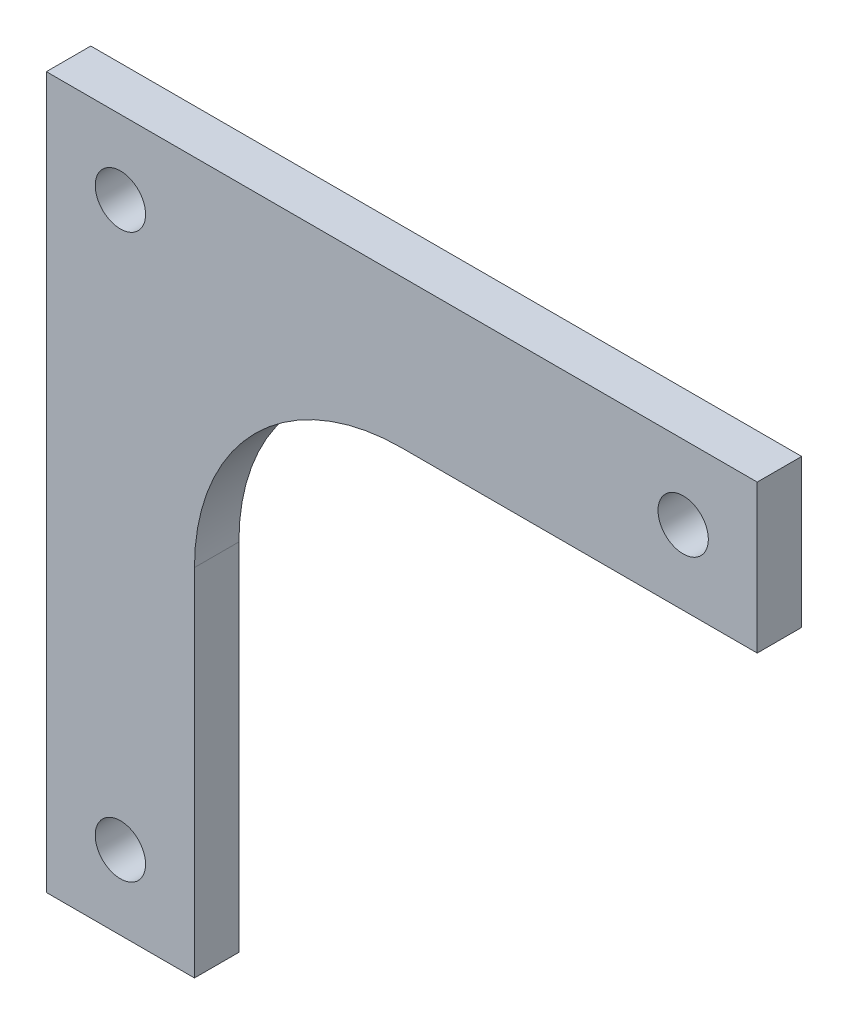
ISO-10303-21;
HEADER;
FILE_DESCRIPTION(('STEP AP214'),'2;1');
FILE_NAME('part.step','',(''),(''),'','','');
FILE_SCHEMA(('AUTOMOTIVE_DESIGN { 1 0 10303 214 1 1 1 1 }'));
ENDSEC;
DATA;
#1=APPLICATION_CONTEXT('core data for automotive mechanical design processes');
#2=APPLICATION_PROTOCOL_DEFINITION('international standard','automotive_design',2000,#1);
#3=PRODUCT_CONTEXT('',#1,'mechanical');
#4=PRODUCT('Part','Part','',(#3));
#5=PRODUCT_RELATED_PRODUCT_CATEGORY('part','',(#4));
#6=PRODUCT_DEFINITION_FORMATION('','',#4);
#7=PRODUCT_DEFINITION_CONTEXT('part definition',#1,'design');
#8=PRODUCT_DEFINITION('design','',#6,#7);
#9=PRODUCT_DEFINITION_SHAPE('','',#8);
#10=(LENGTH_UNIT() NAMED_UNIT(*) SI_UNIT(.MILLI.,.METRE.));
#11=(NAMED_UNIT(*) PLANE_ANGLE_UNIT() SI_UNIT($,.RADIAN.));
#12=(NAMED_UNIT(*) SI_UNIT($,.STERADIAN.) SOLID_ANGLE_UNIT());
#13=UNCERTAINTY_MEASURE_WITH_UNIT(LENGTH_MEASURE(1.E-05),#10,'distance_accuracy_value','');
#14=(GEOMETRIC_REPRESENTATION_CONTEXT(3) GLOBAL_UNCERTAINTY_ASSIGNED_CONTEXT((#13)) GLOBAL_UNIT_ASSIGNED_CONTEXT((#10,
#11,#12)) REPRESENTATION_CONTEXT('',''));
#15=CARTESIAN_POINT('',(0.,0.,0.));
#16=DIRECTION('',(0.,0.,1.));
#17=DIRECTION('',(1.,0.,0.));
#18=AXIS2_PLACEMENT_3D('',#15,#16,#17);
#19=CARTESIAN_POINT('',(24.,0.,3.));
#20=DIRECTION('',(0.,0.,1.));
#21=DIRECTION('',(1.,0.,0.));
#22=AXIS2_PLACEMENT_3D('',#19,#20,#21);
#23=PLANE('',#22);
#24=CARTESIAN_POINT('',(5.,-19.,3.));
#25=DIRECTION('',(0.,0.,1.));
#26=DIRECTION('',(1.,0.,0.));
#27=AXIS2_PLACEMENT_3D('',#24,#25,#26);
#28=CIRCLE('',#27,1.7);
#29=CARTESIAN_POINT('',(6.7,-19.,3.));
#30=VERTEX_POINT('',#29);
#31=EDGE_CURVE('E167',#30,#30,#28,.T.);
#32=ORIENTED_EDGE('',*,*,#31,.F.);
#33=EDGE_LOOP('',(#32));
#34=FACE_BOUND('',#33,.T.);
#35=DIRECTION('',(0.,-1.,0.));
#36=VECTOR('',#35,1.);
#37=CARTESIAN_POINT('',(0.,0.,3.));
#38=LINE('',#37,#36);
#39=CARTESIAN_POINT('',(0.,24.,3.));
#40=VERTEX_POINT('',#39);
#41=CARTESIAN_POINT('',(0.,-24.,3.));
#42=VERTEX_POINT('',#41);
#43=EDGE_CURVE('E87',#40,#42,#38,.T.);
#44=ORIENTED_EDGE('',*,*,#43,.T.);
#45=DIRECTION('',(1.,0.,0.));
#46=VECTOR('',#45,1.);
#47=CARTESIAN_POINT('',(10.,-24.,3.));
#48=LINE('',#47,#46);
#49=CARTESIAN_POINT('',(10.,-24.,3.));
#50=VERTEX_POINT('',#49);
#51=EDGE_CURVE('E153',#42,#50,#48,.T.);
#52=ORIENTED_EDGE('',*,*,#51,.T.);
#53=DIRECTION('',(0.,1.,0.));
#54=VECTOR('',#53,1.);
#55=CARTESIAN_POINT('',(10.,-12.,3.));
#56=LINE('',#55,#54);
#57=CARTESIAN_POINT('',(10.,0.,3.));
#58=VERTEX_POINT('',#57);
#59=EDGE_CURVE('E150',#50,#58,#56,.T.);
#60=ORIENTED_EDGE('',*,*,#59,.T.);
#61=CARTESIAN_POINT('',(24.,0.,3.));
#62=DIRECTION('',(0.,0.,-1.));
#63=DIRECTION('',(1.,0.,0.));
#64=AXIS2_PLACEMENT_3D('',#61,#62,#63);
#65=CIRCLE('',#64,14.);
#66=CARTESIAN_POINT('',(24.,14.,3.));
#67=VERTEX_POINT('',#66);
#68=EDGE_CURVE('E105',#58,#67,#65,.T.);
#69=ORIENTED_EDGE('',*,*,#68,.T.);
#70=DIRECTION('',(1.,0.,0.));
#71=VECTOR('',#70,1.);
#72=CARTESIAN_POINT('',(24.,14.,3.));
#73=LINE('',#72,#71);
#74=CARTESIAN_POINT('',(48.,14.,3.));
#75=VERTEX_POINT('',#74);
#76=EDGE_CURVE('E98',#67,#75,#73,.T.);
#77=ORIENTED_EDGE('',*,*,#76,.T.);
#78=DIRECTION('',(0.,1.,0.));
#79=VECTOR('',#78,1.);
#80=CARTESIAN_POINT('',(48.,24.,3.));
#81=LINE('',#80,#79);
#82=CARTESIAN_POINT('',(48.,24.,3.));
#83=VERTEX_POINT('',#82);
#84=EDGE_CURVE('E102',#75,#83,#81,.T.);
#85=ORIENTED_EDGE('',*,*,#84,.T.);
#86=DIRECTION('',(-1.,0.,0.));
#87=VECTOR('',#86,1.);
#88=CARTESIAN_POINT('',(38.,24.,3.));
#89=LINE('',#88,#87);
#90=EDGE_CURVE('E51',#83,#40,#89,.T.);
#91=ORIENTED_EDGE('',*,*,#90,.T.);
#92=EDGE_LOOP('',(#44,#52,#60,#69,#77,#85,#91));
#93=FACE_BOUND('',#92,.T.);
#94=CARTESIAN_POINT('',(43.,19.,3.));
#95=DIRECTION('',(0.,0.,1.));
#96=DIRECTION('',(1.,0.,0.));
#97=AXIS2_PLACEMENT_3D('',#94,#95,#96);
#98=CIRCLE('',#97,1.7);
#99=CARTESIAN_POINT('',(44.7,19.,3.));
#100=VERTEX_POINT('',#99);
#101=EDGE_CURVE('E128',#100,#100,#98,.T.);
#102=ORIENTED_EDGE('',*,*,#101,.F.);
#103=EDGE_LOOP('',(#102));
#104=FACE_BOUND('',#103,.T.);
#105=CARTESIAN_POINT('',(5.,19.,3.));
#106=DIRECTION('',(0.,0.,1.));
#107=DIRECTION('',(1.,0.,0.));
#108=AXIS2_PLACEMENT_3D('',#105,#106,#107);
#109=CIRCLE('',#108,1.7);
#110=CARTESIAN_POINT('',(6.7,19.,3.));
#111=VERTEX_POINT('',#110);
#112=EDGE_CURVE('E173',#111,#111,#109,.T.);
#113=ORIENTED_EDGE('',*,*,#112,.F.);
#114=EDGE_LOOP('',(#113));
#115=FACE_BOUND('',#114,.T.);
#116=ADVANCED_FACE('F34',(#34,#93,#104,#115),#23,.T.);
#117=CARTESIAN_POINT('',(24.,0.,0.));
#118=DIRECTION('',(0.,0.,1.));
#119=DIRECTION('',(1.,0.,0.));
#120=AXIS2_PLACEMENT_3D('',#117,#118,#119);
#121=PLANE('',#120);
#122=DIRECTION('',(1.,0.,0.));
#123=VECTOR('',#122,1.);
#124=CARTESIAN_POINT('',(10.,-24.,0.));
#125=LINE('',#124,#123);
#126=CARTESIAN_POINT('',(0.,-24.,0.));
#127=VERTEX_POINT('',#126);
#128=CARTESIAN_POINT('',(10.,-24.,0.));
#129=VERTEX_POINT('',#128);
#130=EDGE_CURVE('E124',#127,#129,#125,.T.);
#131=ORIENTED_EDGE('',*,*,#130,.F.);
#132=DIRECTION('',(0.,-1.,0.));
#133=VECTOR('',#132,1.);
#134=CARTESIAN_POINT('',(0.,0.,0.));
#135=LINE('',#134,#133);
#136=CARTESIAN_POINT('',(0.,24.,0.));
#137=VERTEX_POINT('',#136);
#138=EDGE_CURVE('E137',#137,#127,#135,.T.);
#139=ORIENTED_EDGE('',*,*,#138,.F.);
#140=DIRECTION('',(-1.,0.,0.));
#141=VECTOR('',#140,1.);
#142=CARTESIAN_POINT('',(0.,24.,0.));
#143=LINE('',#142,#141);
#144=CARTESIAN_POINT('',(48.,24.,0.));
#145=VERTEX_POINT('',#144);
#146=EDGE_CURVE('E77',#145,#137,#143,.T.);
#147=ORIENTED_EDGE('',*,*,#146,.F.);
#148=DIRECTION('',(0.,1.,0.));
#149=VECTOR('',#148,1.);
#150=CARTESIAN_POINT('',(48.,24.,0.));
#151=LINE('',#150,#149);
#152=CARTESIAN_POINT('',(48.,14.,0.));
#153=VERTEX_POINT('',#152);
#154=EDGE_CURVE('E134',#153,#145,#151,.T.);
#155=ORIENTED_EDGE('',*,*,#154,.F.);
#156=DIRECTION('',(1.,0.,0.));
#157=VECTOR('',#156,1.);
#158=CARTESIAN_POINT('',(48.,14.,0.));
#159=LINE('',#158,#157);
#160=CARTESIAN_POINT('',(24.,14.,0.));
#161=VERTEX_POINT('',#160);
#162=EDGE_CURVE('E113',#161,#153,#159,.T.);
#163=ORIENTED_EDGE('',*,*,#162,.F.);
#164=CARTESIAN_POINT('',(24.,0.,0.));
#165=DIRECTION('',(0.,0.,-1.));
#166=DIRECTION('',(1.,0.,0.));
#167=AXIS2_PLACEMENT_3D('',#164,#165,#166);
#168=CIRCLE('',#167,14.);
#169=CARTESIAN_POINT('',(10.,0.,0.));
#170=VERTEX_POINT('',#169);
#171=EDGE_CURVE('E130',#170,#161,#168,.T.);
#172=ORIENTED_EDGE('',*,*,#171,.F.);
#173=DIRECTION('',(0.,1.,0.));
#174=VECTOR('',#173,1.);
#175=CARTESIAN_POINT('',(10.,0.,0.));
#176=LINE('',#175,#174);
#177=EDGE_CURVE('E127',#129,#170,#176,.T.);
#178=ORIENTED_EDGE('',*,*,#177,.F.);
#179=EDGE_LOOP('',(#131,#139,#147,#155,#163,#172,#178));
#180=FACE_BOUND('',#179,.T.);
#181=CARTESIAN_POINT('',(43.,19.,0.));
#182=DIRECTION('',(0.,0.,1.));
#183=DIRECTION('',(1.,0.,0.));
#184=AXIS2_PLACEMENT_3D('',#181,#182,#183);
#185=CIRCLE('',#184,1.7);
#186=CARTESIAN_POINT('',(44.7,19.,0.));
#187=VERTEX_POINT('',#186);
#188=EDGE_CURVE('E164',#187,#187,#185,.T.);
#189=ORIENTED_EDGE('',*,*,#188,.T.);
#190=EDGE_LOOP('',(#189));
#191=FACE_BOUND('',#190,.T.);
#192=CARTESIAN_POINT('',(5.,-19.,0.));
#193=DIRECTION('',(0.,0.,1.));
#194=DIRECTION('',(1.,0.,0.));
#195=AXIS2_PLACEMENT_3D('',#192,#193,#194);
#196=CIRCLE('',#195,1.7);
#197=CARTESIAN_POINT('',(6.7,-19.,0.));
#198=VERTEX_POINT('',#197);
#199=EDGE_CURVE('E170',#198,#198,#196,.T.);
#200=ORIENTED_EDGE('',*,*,#199,.T.);
#201=EDGE_LOOP('',(#200));
#202=FACE_BOUND('',#201,.T.);
#203=CARTESIAN_POINT('',(5.,19.,0.));
#204=DIRECTION('',(0.,0.,1.));
#205=DIRECTION('',(1.,0.,0.));
#206=AXIS2_PLACEMENT_3D('',#203,#204,#205);
#207=CIRCLE('',#206,1.7);
#208=CARTESIAN_POINT('',(6.7,19.,0.));
#209=VERTEX_POINT('',#208);
#210=EDGE_CURVE('E176',#209,#209,#207,.T.);
#211=ORIENTED_EDGE('',*,*,#210,.T.);
#212=EDGE_LOOP('',(#211));
#213=FACE_BOUND('',#212,.T.);
#214=ADVANCED_FACE('F155',(#180,#191,#202,#213),#121,.F.);
#215=CARTESIAN_POINT('',(10.,-24.,3.));
#216=DIRECTION('',(0.,1.,0.));
#217=DIRECTION('',(0.,0.,1.));
#218=AXIS2_PLACEMENT_3D('',#215,#216,#217);
#219=PLANE('',#218);
#220=ORIENTED_EDGE('',*,*,#130,.T.);
#221=DIRECTION('',(0.,0.,-1.));
#222=VECTOR('',#221,1.);
#223=CARTESIAN_POINT('',(10.,-24.,3.));
#224=LINE('',#223,#222);
#225=EDGE_CURVE('E43',#50,#129,#224,.T.);
#226=ORIENTED_EDGE('',*,*,#225,.F.);
#227=ORIENTED_EDGE('',*,*,#51,.F.);
#228=DIRECTION('',(0.,0.,-1.));
#229=VECTOR('',#228,1.);
#230=CARTESIAN_POINT('',(0.,-24.,3.));
#231=LINE('',#230,#229);
#232=EDGE_CURVE('E11',#42,#127,#231,.T.);
#233=ORIENTED_EDGE('',*,*,#232,.T.);
#234=EDGE_LOOP('',(#220,#226,#227,#233));
#235=FACE_BOUND('',#234,.T.);
#236=ADVANCED_FACE('F36',(#235),#219,.F.);
#237=CARTESIAN_POINT('',(10.,0.,3.));
#238=DIRECTION('',(-1.,0.,0.));
#239=DIRECTION('',(0.,-1.,0.));
#240=AXIS2_PLACEMENT_3D('',#237,#238,#239);
#241=PLANE('',#240);
#242=ORIENTED_EDGE('',*,*,#177,.T.);
#243=DIRECTION('',(0.,0.,-1.));
#244=VECTOR('',#243,1.);
#245=CARTESIAN_POINT('',(10.,0.,3.));
#246=LINE('',#245,#244);
#247=EDGE_CURVE('E142',#58,#170,#246,.T.);
#248=ORIENTED_EDGE('',*,*,#247,.F.);
#249=ORIENTED_EDGE('',*,*,#59,.F.);
#250=ORIENTED_EDGE('',*,*,#225,.T.);
#251=EDGE_LOOP('',(#242,#248,#249,#250));
#252=FACE_BOUND('',#251,.T.);
#253=ADVANCED_FACE('F148',(#252),#241,.F.);
#254=CARTESIAN_POINT('',(24.,0.,3.));
#255=DIRECTION('',(0.,0.,-1.));
#256=DIRECTION('',(-1.,0.,0.));
#257=AXIS2_PLACEMENT_3D('',#254,#255,#256);
#258=CYLINDRICAL_SURFACE('',#257,14.);
#259=ORIENTED_EDGE('',*,*,#171,.T.);
#260=DIRECTION('',(0.,0.,-1.));
#261=VECTOR('',#260,1.);
#262=CARTESIAN_POINT('',(24.,14.,3.));
#263=LINE('',#262,#261);
#264=EDGE_CURVE('E115',#67,#161,#263,.T.);
#265=ORIENTED_EDGE('',*,*,#264,.F.);
#266=ORIENTED_EDGE('',*,*,#68,.F.);
#267=ORIENTED_EDGE('',*,*,#247,.T.);
#268=EDGE_LOOP('',(#259,#265,#266,#267));
#269=FACE_BOUND('',#268,.T.);
#270=ADVANCED_FACE('F159',(#269),#258,.F.);
#271=CARTESIAN_POINT('',(48.,14.,3.));
#272=DIRECTION('',(0.,1.,0.));
#273=DIRECTION('',(-1.,0.,0.));
#274=AXIS2_PLACEMENT_3D('',#271,#272,#273);
#275=PLANE('',#274);
#276=ORIENTED_EDGE('',*,*,#162,.T.);
#277=DIRECTION('',(0.,0.,-1.));
#278=VECTOR('',#277,1.);
#279=CARTESIAN_POINT('',(48.,14.,3.));
#280=LINE('',#279,#278);
#281=EDGE_CURVE('E111',#75,#153,#280,.T.);
#282=ORIENTED_EDGE('',*,*,#281,.F.);
#283=ORIENTED_EDGE('',*,*,#76,.F.);
#284=ORIENTED_EDGE('',*,*,#264,.T.);
#285=EDGE_LOOP('',(#276,#282,#283,#284));
#286=FACE_BOUND('',#285,.T.);
#287=ADVANCED_FACE('F112',(#286),#275,.F.);
#288=CARTESIAN_POINT('',(48.,24.,3.));
#289=DIRECTION('',(-1.,0.,0.));
#290=DIRECTION('',(0.,0.,1.));
#291=AXIS2_PLACEMENT_3D('',#288,#289,#290);
#292=PLANE('',#291);
#293=ORIENTED_EDGE('',*,*,#154,.T.);
#294=DIRECTION('',(0.,0.,-1.));
#295=VECTOR('',#294,1.);
#296=CARTESIAN_POINT('',(48.,24.,3.));
#297=LINE('',#296,#295);
#298=EDGE_CURVE('E116',#83,#145,#297,.T.);
#299=ORIENTED_EDGE('',*,*,#298,.F.);
#300=ORIENTED_EDGE('',*,*,#84,.F.);
#301=ORIENTED_EDGE('',*,*,#281,.T.);
#302=EDGE_LOOP('',(#293,#299,#300,#301));
#303=FACE_BOUND('',#302,.T.);
#304=ADVANCED_FACE('F118',(#303),#292,.F.);
#305=CARTESIAN_POINT('',(0.,24.,3.));
#306=DIRECTION('',(0.,-1.,0.));
#307=DIRECTION('',(0.,0.,-1.));
#308=AXIS2_PLACEMENT_3D('',#305,#306,#307);
#309=PLANE('',#308);
#310=ORIENTED_EDGE('',*,*,#146,.T.);
#311=DIRECTION('',(0.,0.,-1.));
#312=VECTOR('',#311,1.);
#313=CARTESIAN_POINT('',(0.,24.,3.));
#314=LINE('',#313,#312);
#315=EDGE_CURVE('E120',#40,#137,#314,.T.);
#316=ORIENTED_EDGE('',*,*,#315,.F.);
#317=ORIENTED_EDGE('',*,*,#90,.F.);
#318=ORIENTED_EDGE('',*,*,#298,.T.);
#319=EDGE_LOOP('',(#310,#316,#317,#318));
#320=FACE_BOUND('',#319,.T.);
#321=ADVANCED_FACE('F200',(#320),#309,.F.);
#322=CARTESIAN_POINT('',(0.,0.,3.));
#323=DIRECTION('',(1.,0.,0.));
#324=DIRECTION('',(0.,0.,-1.));
#325=AXIS2_PLACEMENT_3D('',#322,#323,#324);
#326=PLANE('',#325);
#327=ORIENTED_EDGE('',*,*,#138,.T.);
#328=ORIENTED_EDGE('',*,*,#232,.F.);
#329=ORIENTED_EDGE('',*,*,#43,.F.);
#330=ORIENTED_EDGE('',*,*,#315,.T.);
#331=EDGE_LOOP('',(#327,#328,#329,#330));
#332=FACE_BOUND('',#331,.T.);
#333=ADVANCED_FACE('F197',(#332),#326,.F.);
#334=CARTESIAN_POINT('',(43.,19.,3.));
#335=DIRECTION('',(0.,0.,-1.));
#336=DIRECTION('',(-1.,0.,0.));
#337=AXIS2_PLACEMENT_3D('',#334,#335,#336);
#338=CYLINDRICAL_SURFACE('',#337,1.7);
#339=ORIENTED_EDGE('',*,*,#101,.T.);
#340=EDGE_LOOP('',(#339));
#341=FACE_BOUND('',#340,.T.);
#342=ORIENTED_EDGE('',*,*,#188,.F.);
#343=EDGE_LOOP('',(#342));
#344=FACE_BOUND('',#343,.T.);
#345=ADVANCED_FACE('F194',(#341,#344),#338,.F.);
#346=CARTESIAN_POINT('',(5.,-19.,3.));
#347=DIRECTION('',(0.,0.,-1.));
#348=DIRECTION('',(-1.,0.,0.));
#349=AXIS2_PLACEMENT_3D('',#346,#347,#348);
#350=CYLINDRICAL_SURFACE('',#349,1.7);
#351=ORIENTED_EDGE('',*,*,#31,.T.);
#352=EDGE_LOOP('',(#351));
#353=FACE_BOUND('',#352,.T.);
#354=ORIENTED_EDGE('',*,*,#199,.F.);
#355=EDGE_LOOP('',(#354));
#356=FACE_BOUND('',#355,.T.);
#357=ADVANCED_FACE('F282',(#353,#356),#350,.F.);
#358=CARTESIAN_POINT('',(5.,19.,3.));
#359=DIRECTION('',(0.,0.,-1.));
#360=DIRECTION('',(-1.,0.,0.));
#361=AXIS2_PLACEMENT_3D('',#358,#359,#360);
#362=CYLINDRICAL_SURFACE('',#361,1.7);
#363=ORIENTED_EDGE('',*,*,#112,.T.);
#364=EDGE_LOOP('',(#363));
#365=FACE_BOUND('',#364,.T.);
#366=ORIENTED_EDGE('',*,*,#210,.F.);
#367=EDGE_LOOP('',(#366));
#368=FACE_BOUND('',#367,.T.);
#369=ADVANCED_FACE('F182',(#365,#368),#362,.F.);
#370=CLOSED_SHELL('',(#116,#214,#236,#253,#270,#287,#304,#321,#333,#345,#357,#369));
#371=MANIFOLD_SOLID_BREP('B2',#370);
#372=ADVANCED_BREP_SHAPE_REPRESENTATION('',(#18,#371),#14);
#373=SHAPE_DEFINITION_REPRESENTATION(#9,#372);
ENDSEC;
END-ISO-10303-21;
